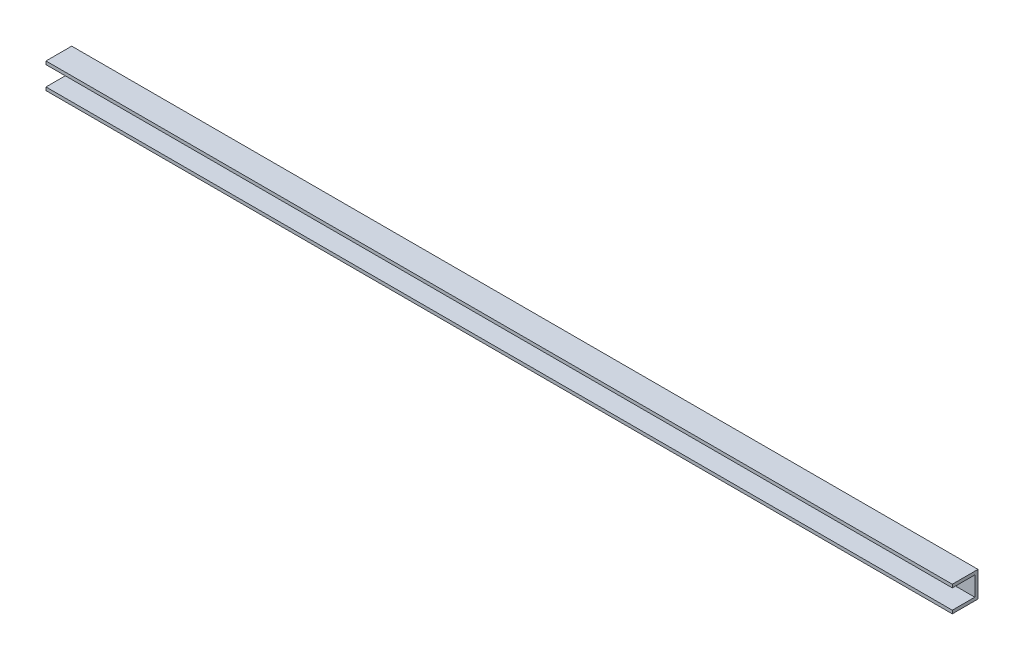
ISO-10303-21;
HEADER;
FILE_DESCRIPTION(('STEP AP214'),'2;1');
FILE_NAME('part.step','',(''),(''),'','','');
FILE_SCHEMA(('AUTOMOTIVE_DESIGN { 1 0 10303 214 1 1 1 1 }'));
ENDSEC;
DATA;
#1=APPLICATION_CONTEXT('core data for automotive mechanical design processes');
#2=APPLICATION_PROTOCOL_DEFINITION('international standard','automotive_design',2000,#1);
#3=PRODUCT_CONTEXT('',#1,'mechanical');
#4=PRODUCT('Part','Part','',(#3));
#5=PRODUCT_RELATED_PRODUCT_CATEGORY('part','',(#4));
#6=PRODUCT_DEFINITION_FORMATION('','',#4);
#7=PRODUCT_DEFINITION_CONTEXT('part definition',#1,'design');
#8=PRODUCT_DEFINITION('design','',#6,#7);
#9=PRODUCT_DEFINITION_SHAPE('','',#8);
#10=(LENGTH_UNIT() NAMED_UNIT(*) SI_UNIT(.MILLI.,.METRE.));
#11=(NAMED_UNIT(*) PLANE_ANGLE_UNIT() SI_UNIT($,.RADIAN.));
#12=(NAMED_UNIT(*) SI_UNIT($,.STERADIAN.) SOLID_ANGLE_UNIT());
#13=UNCERTAINTY_MEASURE_WITH_UNIT(LENGTH_MEASURE(1.E-05),#10,'distance_accuracy_value','');
#14=(GEOMETRIC_REPRESENTATION_CONTEXT(3) GLOBAL_UNCERTAINTY_ASSIGNED_CONTEXT((#13)) GLOBAL_UNIT_ASSIGNED_CONTEXT((#10,
#11,#12)) REPRESENTATION_CONTEXT('',''));
#15=CARTESIAN_POINT('',(0.,0.,0.));
#16=DIRECTION('',(0.,0.,1.));
#17=DIRECTION('',(1.,0.,0.));
#18=AXIS2_PLACEMENT_3D('',#15,#16,#17);
#19=CARTESIAN_POINT('',(895.35,4.73507549211786,4.17523715066768));
#20=DIRECTION('',(0.,-1.,0.));
#21=DIRECTION('',(0.,0.,-1.));
#22=AXIS2_PLACEMENT_3D('',#19,#20,#21);
#23=PLANE('',#22);
#24=DIRECTION('',(0.,0.,1.));
#25=VECTOR('',#24,1.);
#26=CARTESIAN_POINT('',(0.,4.73507549211786,4.17523715066768));
#27=LINE('',#26,#25);
#28=CARTESIAN_POINT('',(0.,4.73507549211786,4.17523715066768));
#29=VERTEX_POINT('',#28);
#30=CARTESIAN_POINT('',(0.,4.73507549211786,29.5752371506677));
#31=VERTEX_POINT('',#30);
#32=EDGE_CURVE('E129',#29,#31,#27,.T.);
#33=ORIENTED_EDGE('',*,*,#32,.T.);
#34=DIRECTION('',(-1.,0.,0.));
#35=VECTOR('',#34,1.);
#36=CARTESIAN_POINT('',(895.35,4.73507549211786,29.5752371506677));
#37=LINE('',#36,#35);
#38=CARTESIAN_POINT('',(895.35,4.73507549211786,29.5752371506677));
#39=VERTEX_POINT('',#38);
#40=EDGE_CURVE('E11',#39,#31,#37,.T.);
#41=ORIENTED_EDGE('',*,*,#40,.F.);
#42=DIRECTION('',(0.,0.,1.));
#43=VECTOR('',#42,1.);
#44=CARTESIAN_POINT('',(895.35,4.73507549211786,4.17523715066768));
#45=LINE('',#44,#43);
#46=CARTESIAN_POINT('',(895.35,4.73507549211786,4.17523715066768));
#47=VERTEX_POINT('',#46);
#48=EDGE_CURVE('E143',#47,#39,#45,.T.);
#49=ORIENTED_EDGE('',*,*,#48,.F.);
#50=DIRECTION('',(-1.,0.,0.));
#51=VECTOR('',#50,1.);
#52=CARTESIAN_POINT('',(895.35,4.73507549211786,4.17523715066768));
#53=LINE('',#52,#51);
#54=EDGE_CURVE('E125',#47,#29,#53,.T.);
#55=ORIENTED_EDGE('',*,*,#54,.T.);
#56=EDGE_LOOP('',(#33,#41,#49,#55));
#57=FACE_BOUND('',#56,.T.);
#58=ADVANCED_FACE('F33',(#57),#23,.F.);
#59=CARTESIAN_POINT('',(895.35,4.73507549211786,29.5752371506677));
#60=DIRECTION('',(0.,0.,-1.));
#61=DIRECTION('',(-1.,0.,0.));
#62=AXIS2_PLACEMENT_3D('',#59,#60,#61);
#63=PLANE('',#62);
#64=DIRECTION('',(0.,-1.,0.));
#65=VECTOR('',#64,1.);
#66=CARTESIAN_POINT('',(0.,4.73507549211786,29.5752371506677));
#67=LINE('',#66,#65);
#68=CARTESIAN_POINT('',(0.,1.56007549211786,29.5752371506677));
#69=VERTEX_POINT('',#68);
#70=EDGE_CURVE('E132',#31,#69,#67,.T.);
#71=ORIENTED_EDGE('',*,*,#70,.T.);
#72=DIRECTION('',(-1.,0.,0.));
#73=VECTOR('',#72,1.);
#74=CARTESIAN_POINT('',(895.35,1.56007549211786,29.5752371506677));
#75=LINE('',#74,#73);
#76=CARTESIAN_POINT('',(895.35,1.56007549211786,29.5752371506677));
#77=VERTEX_POINT('',#76);
#78=EDGE_CURVE('E41',#77,#69,#75,.T.);
#79=ORIENTED_EDGE('',*,*,#78,.F.);
#80=DIRECTION('',(0.,-1.,0.));
#81=VECTOR('',#80,1.);
#82=CARTESIAN_POINT('',(895.35,4.73507549211786,29.5752371506677));
#83=LINE('',#82,#81);
#84=EDGE_CURVE('E92',#39,#77,#83,.T.);
#85=ORIENTED_EDGE('',*,*,#84,.F.);
#86=ORIENTED_EDGE('',*,*,#40,.T.);
#87=EDGE_LOOP('',(#71,#79,#85,#86));
#88=FACE_BOUND('',#87,.T.);
#89=ADVANCED_FACE('F178',(#88),#63,.F.);
#90=CARTESIAN_POINT('',(895.35,1.56007549211786,29.5752371506677));
#91=DIRECTION('',(0.,1.,0.));
#92=DIRECTION('',(0.,0.,1.));
#93=AXIS2_PLACEMENT_3D('',#90,#91,#92);
#94=PLANE('',#93);
#95=DIRECTION('',(0.,0.,-1.));
#96=VECTOR('',#95,1.);
#97=CARTESIAN_POINT('',(0.,1.56007549211786,29.5752371506677));
#98=LINE('',#97,#96);
#99=CARTESIAN_POINT('',(0.,1.56007549211786,7.35023715066768));
#100=VERTEX_POINT('',#99);
#101=EDGE_CURVE('E134',#69,#100,#98,.T.);
#102=ORIENTED_EDGE('',*,*,#101,.T.);
#103=DIRECTION('',(-1.,0.,0.));
#104=VECTOR('',#103,1.);
#105=CARTESIAN_POINT('',(895.35,1.56007549211786,7.35023715066768));
#106=LINE('',#105,#104);
#107=CARTESIAN_POINT('',(895.35,1.56007549211786,7.35023715066768));
#108=VERTEX_POINT('',#107);
#109=EDGE_CURVE('E150',#108,#100,#106,.T.);
#110=ORIENTED_EDGE('',*,*,#109,.F.);
#111=DIRECTION('',(0.,0.,-1.));
#112=VECTOR('',#111,1.);
#113=CARTESIAN_POINT('',(895.35,1.56007549211786,29.5752371506677));
#114=LINE('',#113,#112);
#115=EDGE_CURVE('E158',#77,#108,#114,.T.);
#116=ORIENTED_EDGE('',*,*,#115,.F.);
#117=ORIENTED_EDGE('',*,*,#78,.T.);
#118=EDGE_LOOP('',(#102,#110,#116,#117));
#119=FACE_BOUND('',#118,.T.);
#120=ADVANCED_FACE('F156',(#119),#94,.F.);
#121=CARTESIAN_POINT('',(895.35,1.56007549211786,7.35023715066768));
#122=DIRECTION('',(0.,0.,-1.));
#123=DIRECTION('',(0.,1.,0.));
#124=AXIS2_PLACEMENT_3D('',#121,#122,#123);
#125=PLANE('',#124);
#126=DIRECTION('',(0.,-1.,0.));
#127=VECTOR('',#126,1.);
#128=CARTESIAN_POINT('',(0.,1.56007549211786,7.35023715066768));
#129=LINE('',#128,#127);
#130=CARTESIAN_POINT('',(0.,-17.4899245078821,7.35023715066768));
#131=VERTEX_POINT('',#130);
#132=EDGE_CURVE('E136',#100,#131,#129,.T.);
#133=ORIENTED_EDGE('',*,*,#132,.T.);
#134=DIRECTION('',(-1.,0.,0.));
#135=VECTOR('',#134,1.);
#136=CARTESIAN_POINT('',(895.35,-17.4899245078821,7.35023715066768));
#137=LINE('',#136,#135);
#138=CARTESIAN_POINT('',(895.35,-17.4899245078821,7.35023715066768));
#139=VERTEX_POINT('',#138);
#140=EDGE_CURVE('E147',#139,#131,#137,.T.);
#141=ORIENTED_EDGE('',*,*,#140,.F.);
#142=DIRECTION('',(0.,-1.,0.));
#143=VECTOR('',#142,1.);
#144=CARTESIAN_POINT('',(895.35,1.56007549211786,7.35023715066768));
#145=LINE('',#144,#143);
#146=EDGE_CURVE('E170',#108,#139,#145,.T.);
#147=ORIENTED_EDGE('',*,*,#146,.F.);
#148=ORIENTED_EDGE('',*,*,#109,.T.);
#149=EDGE_LOOP('',(#133,#141,#147,#148));
#150=FACE_BOUND('',#149,.T.);
#151=ADVANCED_FACE('F166',(#150),#125,.F.);
#152=CARTESIAN_POINT('',(895.35,-17.4899245078821,7.35023715066768));
#153=DIRECTION('',(0.,-1.,0.));
#154=DIRECTION('',(0.,0.,-1.));
#155=AXIS2_PLACEMENT_3D('',#152,#153,#154);
#156=PLANE('',#155);
#157=DIRECTION('',(0.,0.,1.));
#158=VECTOR('',#157,1.);
#159=CARTESIAN_POINT('',(0.,-17.4899245078821,7.35023715066768));
#160=LINE('',#159,#158);
#161=CARTESIAN_POINT('',(0.,-17.4899245078821,29.5752371506677));
#162=VERTEX_POINT('',#161);
#163=EDGE_CURVE('E138',#131,#162,#160,.T.);
#164=ORIENTED_EDGE('',*,*,#163,.T.);
#165=DIRECTION('',(-1.,0.,0.));
#166=VECTOR('',#165,1.);
#167=CARTESIAN_POINT('',(895.35,-17.4899245078821,29.5752371506677));
#168=LINE('',#167,#166);
#169=CARTESIAN_POINT('',(895.35,-17.4899245078821,29.5752371506677));
#170=VERTEX_POINT('',#169);
#171=EDGE_CURVE('E120',#170,#162,#168,.T.);
#172=ORIENTED_EDGE('',*,*,#171,.F.);
#173=DIRECTION('',(0.,0.,1.));
#174=VECTOR('',#173,1.);
#175=CARTESIAN_POINT('',(895.35,-17.4899245078821,7.35023715066768));
#176=LINE('',#175,#174);
#177=EDGE_CURVE('E111',#139,#170,#176,.T.);
#178=ORIENTED_EDGE('',*,*,#177,.F.);
#179=ORIENTED_EDGE('',*,*,#140,.T.);
#180=EDGE_LOOP('',(#164,#172,#178,#179));
#181=FACE_BOUND('',#180,.T.);
#182=ADVANCED_FACE('F169',(#181),#156,.F.);
#183=CARTESIAN_POINT('',(895.35,-17.4899245078821,29.5752371506677));
#184=DIRECTION('',(0.,0.,-1.));
#185=DIRECTION('',(-1.,0.,0.));
#186=AXIS2_PLACEMENT_3D('',#183,#184,#185);
#187=PLANE('',#186);
#188=DIRECTION('',(0.,-1.,0.));
#189=VECTOR('',#188,1.);
#190=CARTESIAN_POINT('',(0.,-17.4899245078821,29.5752371506677));
#191=LINE('',#190,#189);
#192=CARTESIAN_POINT('',(0.,-20.6649245078822,29.5752371506677));
#193=VERTEX_POINT('',#192);
#194=EDGE_CURVE('E119',#162,#193,#191,.T.);
#195=ORIENTED_EDGE('',*,*,#194,.T.);
#196=DIRECTION('',(-1.,0.,0.));
#197=VECTOR('',#196,1.);
#198=CARTESIAN_POINT('',(895.35,-20.6649245078822,29.5752371506677));
#199=LINE('',#198,#197);
#200=CARTESIAN_POINT('',(895.35,-20.6649245078822,29.5752371506677));
#201=VERTEX_POINT('',#200);
#202=EDGE_CURVE('E116',#201,#193,#199,.T.);
#203=ORIENTED_EDGE('',*,*,#202,.F.);
#204=DIRECTION('',(0.,-1.,0.));
#205=VECTOR('',#204,1.);
#206=CARTESIAN_POINT('',(895.35,-17.4899245078821,29.5752371506677));
#207=LINE('',#206,#205);
#208=EDGE_CURVE('E105',#170,#201,#207,.T.);
#209=ORIENTED_EDGE('',*,*,#208,.F.);
#210=ORIENTED_EDGE('',*,*,#171,.T.);
#211=EDGE_LOOP('',(#195,#203,#209,#210));
#212=FACE_BOUND('',#211,.T.);
#213=ADVANCED_FACE('F117',(#212),#187,.F.);
#214=CARTESIAN_POINT('',(895.35,-20.6649245078822,29.5752371506677));
#215=DIRECTION('',(0.,1.,0.));
#216=DIRECTION('',(0.,0.,1.));
#217=AXIS2_PLACEMENT_3D('',#214,#215,#216);
#218=PLANE('',#217);
#219=DIRECTION('',(0.,0.,-1.));
#220=VECTOR('',#219,1.);
#221=CARTESIAN_POINT('',(0.,-20.6649245078822,29.5752371506677));
#222=LINE('',#221,#220);
#223=CARTESIAN_POINT('',(0.,-20.6649245078822,4.17523715066768));
#224=VERTEX_POINT('',#223);
#225=EDGE_CURVE('E78',#193,#224,#222,.T.);
#226=ORIENTED_EDGE('',*,*,#225,.T.);
#227=DIRECTION('',(-1.,0.,0.));
#228=VECTOR('',#227,1.);
#229=CARTESIAN_POINT('',(895.35,-20.6649245078822,4.17523715066768));
#230=LINE('',#229,#228);
#231=CARTESIAN_POINT('',(895.35,-20.6649245078822,4.17523715066768));
#232=VERTEX_POINT('',#231);
#233=EDGE_CURVE('E121',#232,#224,#230,.T.);
#234=ORIENTED_EDGE('',*,*,#233,.F.);
#235=DIRECTION('',(0.,0.,-1.));
#236=VECTOR('',#235,1.);
#237=CARTESIAN_POINT('',(895.35,-20.6649245078822,29.5752371506677));
#238=LINE('',#237,#236);
#239=EDGE_CURVE('E109',#201,#232,#238,.T.);
#240=ORIENTED_EDGE('',*,*,#239,.F.);
#241=ORIENTED_EDGE('',*,*,#202,.T.);
#242=EDGE_LOOP('',(#226,#234,#240,#241));
#243=FACE_BOUND('',#242,.T.);
#244=ADVANCED_FACE('F123',(#243),#218,.F.);
#245=CARTESIAN_POINT('',(895.35,-20.6649245078822,4.17523715066768));
#246=DIRECTION('',(0.,0.,1.));
#247=DIRECTION('',(1.,0.,0.));
#248=AXIS2_PLACEMENT_3D('',#245,#246,#247);
#249=PLANE('',#248);
#250=DIRECTION('',(0.,1.,0.));
#251=VECTOR('',#250,1.);
#252=CARTESIAN_POINT('',(0.,-20.6649245078822,4.17523715066768));
#253=LINE('',#252,#251);
#254=EDGE_CURVE('E84',#224,#29,#253,.T.);
#255=ORIENTED_EDGE('',*,*,#254,.T.);
#256=ORIENTED_EDGE('',*,*,#54,.F.);
#257=DIRECTION('',(0.,1.,0.));
#258=VECTOR('',#257,1.);
#259=CARTESIAN_POINT('',(895.35,-20.6649245078822,4.17523715066768));
#260=LINE('',#259,#258);
#261=EDGE_CURVE('E49',#232,#47,#260,.T.);
#262=ORIENTED_EDGE('',*,*,#261,.F.);
#263=ORIENTED_EDGE('',*,*,#233,.T.);
#264=EDGE_LOOP('',(#255,#256,#262,#263));
#265=FACE_BOUND('',#264,.T.);
#266=ADVANCED_FACE('F194',(#265),#249,.F.);
#267=CARTESIAN_POINT('',(895.35,0.,0.));
#268=DIRECTION('',(1.,0.,0.));
#269=DIRECTION('',(0.,0.,-1.));
#270=AXIS2_PLACEMENT_3D('',#267,#268,#269);
#271=PLANE('',#270);
#272=ORIENTED_EDGE('',*,*,#48,.T.);
#273=ORIENTED_EDGE('',*,*,#84,.T.);
#274=ORIENTED_EDGE('',*,*,#115,.T.);
#275=ORIENTED_EDGE('',*,*,#146,.T.);
#276=ORIENTED_EDGE('',*,*,#177,.T.);
#277=ORIENTED_EDGE('',*,*,#208,.T.);
#278=ORIENTED_EDGE('',*,*,#239,.T.);
#279=ORIENTED_EDGE('',*,*,#261,.T.);
#280=EDGE_LOOP('',(#272,#273,#274,#275,#276,#277,#278,#279));
#281=FACE_BOUND('',#280,.T.);
#282=ADVANCED_FACE('F107',(#281),#271,.T.);
#283=CARTESIAN_POINT('',(0.,0.,0.));
#284=DIRECTION('',(1.,0.,0.));
#285=DIRECTION('',(0.,0.,-1.));
#286=AXIS2_PLACEMENT_3D('',#283,#284,#285);
#287=PLANE('',#286);
#288=ORIENTED_EDGE('',*,*,#32,.F.);
#289=ORIENTED_EDGE('',*,*,#254,.F.);
#290=ORIENTED_EDGE('',*,*,#225,.F.);
#291=ORIENTED_EDGE('',*,*,#194,.F.);
#292=ORIENTED_EDGE('',*,*,#163,.F.);
#293=ORIENTED_EDGE('',*,*,#132,.F.);
#294=ORIENTED_EDGE('',*,*,#101,.F.);
#295=ORIENTED_EDGE('',*,*,#70,.F.);
#296=EDGE_LOOP('',(#288,#289,#290,#291,#292,#293,#294,#295));
#297=FACE_BOUND('',#296,.T.);
#298=ADVANCED_FACE('F162',(#297),#287,.F.);
#299=CLOSED_SHELL('',(#58,#89,#120,#151,#182,#213,#244,#266,#282,#298));
#300=MANIFOLD_SOLID_BREP('B2',#299);
#301=ADVANCED_BREP_SHAPE_REPRESENTATION('',(#18,#300),#14);
#302=SHAPE_DEFINITION_REPRESENTATION(#9,#301);
ENDSEC;
END-ISO-10303-21;
